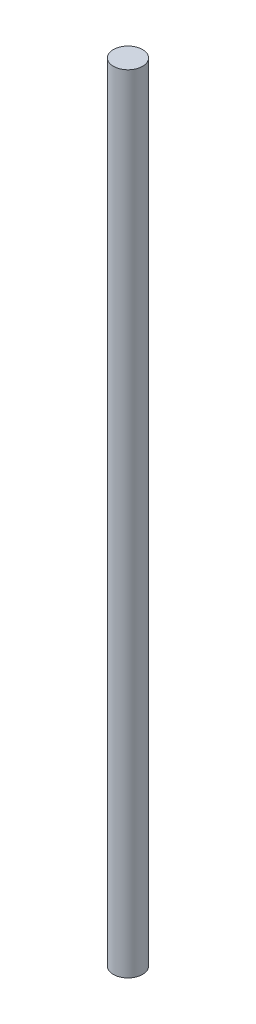
ISO-10303-21;
HEADER;
FILE_DESCRIPTION(('STEP AP214'),'2;1');
FILE_NAME('part.step','',(''),(''),'','','');
FILE_SCHEMA(('AUTOMOTIVE_DESIGN { 1 0 10303 214 1 1 1 1 }'));
ENDSEC;
DATA;
#1=APPLICATION_CONTEXT('core data for automotive mechanical design processes');
#2=APPLICATION_PROTOCOL_DEFINITION('international standard','automotive_design',2000,#1);
#3=PRODUCT_CONTEXT('',#1,'mechanical');
#4=PRODUCT('Part','Part','',(#3));
#5=PRODUCT_RELATED_PRODUCT_CATEGORY('part','',(#4));
#6=PRODUCT_DEFINITION_FORMATION('','',#4);
#7=PRODUCT_DEFINITION_CONTEXT('part definition',#1,'design');
#8=PRODUCT_DEFINITION('design','',#6,#7);
#9=PRODUCT_DEFINITION_SHAPE('','',#8);
#10=(LENGTH_UNIT() NAMED_UNIT(*) SI_UNIT(.MILLI.,.METRE.));
#11=(NAMED_UNIT(*) PLANE_ANGLE_UNIT() SI_UNIT($,.RADIAN.));
#12=(NAMED_UNIT(*) SI_UNIT($,.STERADIAN.) SOLID_ANGLE_UNIT());
#13=UNCERTAINTY_MEASURE_WITH_UNIT(LENGTH_MEASURE(1.E-05),#10,'distance_accuracy_value','');
#14=(GEOMETRIC_REPRESENTATION_CONTEXT(3) GLOBAL_UNCERTAINTY_ASSIGNED_CONTEXT((#13)) GLOBAL_UNIT_ASSIGNED_CONTEXT((#10,
#11,#12)) REPRESENTATION_CONTEXT('',''));
#15=CARTESIAN_POINT('',(0.,0.,0.));
#16=DIRECTION('',(0.,0.,1.));
#17=DIRECTION('',(1.,0.,0.));
#18=AXIS2_PLACEMENT_3D('',#15,#16,#17);
#19=CARTESIAN_POINT('',(0.,54.,0.));
#20=DIRECTION('',(0.,-1.,0.));
#21=DIRECTION('',(0.,0.,-1.));
#22=AXIS2_PLACEMENT_3D('',#19,#20,#21);
#23=CYLINDRICAL_SURFACE('',#22,1.);
#24=CARTESIAN_POINT('',(0.,54.,0.));
#25=DIRECTION('',(0.,1.,0.));
#26=DIRECTION('',(0.,0.,1.));
#27=AXIS2_PLACEMENT_3D('',#24,#25,#26);
#28=CIRCLE('',#27,1.);
#29=CARTESIAN_POINT('',(0.,54.,1.));
#30=VERTEX_POINT('',#29);
#31=EDGE_CURVE('E10',#30,#30,#28,.T.);
#32=ORIENTED_EDGE('',*,*,#31,.F.);
#33=EDGE_LOOP('',(#32));
#34=FACE_BOUND('',#33,.T.);
#35=CARTESIAN_POINT('',(0.,0.,0.));
#36=DIRECTION('',(0.,1.,0.));
#37=DIRECTION('',(0.,0.,1.));
#38=AXIS2_PLACEMENT_3D('',#35,#36,#37);
#39=CIRCLE('',#38,1.);
#40=CARTESIAN_POINT('',(0.,0.,1.));
#41=VERTEX_POINT('',#40);
#42=EDGE_CURVE('E34',#41,#41,#39,.T.);
#43=ORIENTED_EDGE('',*,*,#42,.T.);
#44=EDGE_LOOP('',(#43));
#45=FACE_BOUND('',#44,.T.);
#46=ADVANCED_FACE('F31',(#34,#45),#23,.T.);
#47=CARTESIAN_POINT('',(0.,54.,0.));
#48=DIRECTION('',(0.,1.,0.));
#49=DIRECTION('',(0.,0.,1.));
#50=AXIS2_PLACEMENT_3D('',#47,#48,#49);
#51=PLANE('',#50);
#52=ORIENTED_EDGE('',*,*,#31,.T.);
#53=EDGE_LOOP('',(#52));
#54=FACE_BOUND('',#53,.T.);
#55=ADVANCED_FACE('F46',(#54),#51,.T.);
#56=CARTESIAN_POINT('',(0.,0.,0.));
#57=DIRECTION('',(0.,1.,0.));
#58=DIRECTION('',(0.,0.,1.));
#59=AXIS2_PLACEMENT_3D('',#56,#57,#58);
#60=PLANE('',#59);
#61=ORIENTED_EDGE('',*,*,#42,.F.);
#62=EDGE_LOOP('',(#61));
#63=FACE_BOUND('',#62,.T.);
#64=ADVANCED_FACE('F44',(#63),#60,.F.);
#65=CLOSED_SHELL('',(#46,#55,#64));
#66=MANIFOLD_SOLID_BREP('B2',#65);
#67=ADVANCED_BREP_SHAPE_REPRESENTATION('',(#18,#66),#14);
#68=SHAPE_DEFINITION_REPRESENTATION(#9,#67);
ENDSEC;
END-ISO-10303-21;
